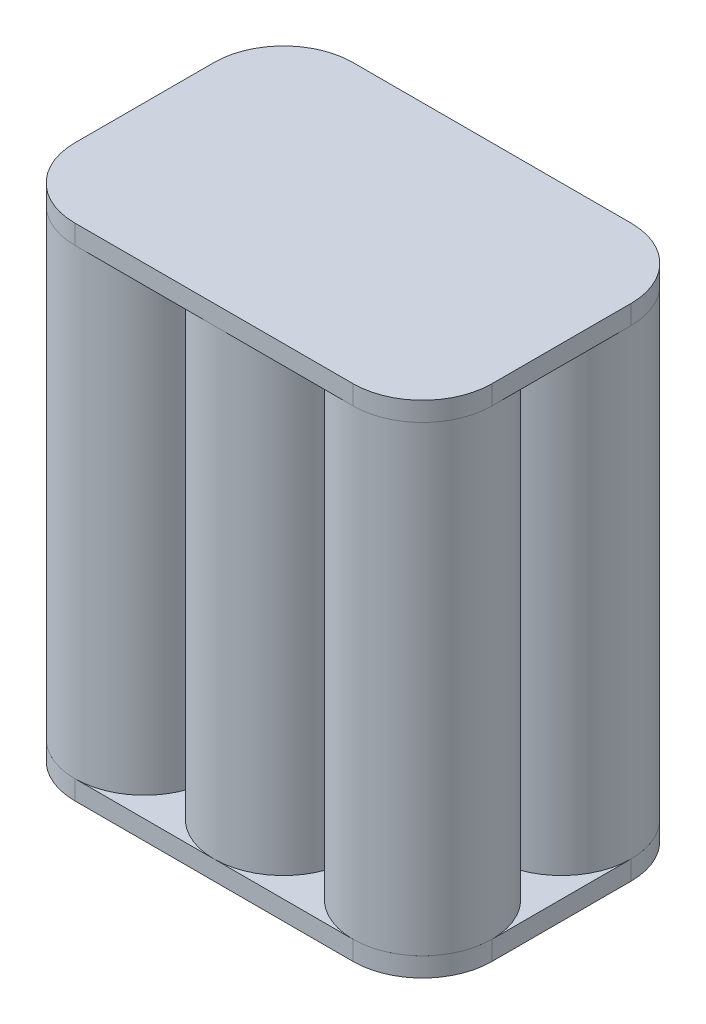
ISO-10303-21;
HEADER;
FILE_DESCRIPTION(('STEP AP214'),'2;1');
FILE_NAME('part.step','',(''),(''),'','','');
FILE_SCHEMA(('AUTOMOTIVE_DESIGN { 1 0 10303 214 1 1 1 1 }'));
ENDSEC;
DATA;
#1=APPLICATION_CONTEXT('core data for automotive mechanical design processes');
#2=APPLICATION_PROTOCOL_DEFINITION('international standard','automotive_design',2000,#1);
#3=PRODUCT_CONTEXT('',#1,'mechanical');
#4=PRODUCT('Part','Part','',(#3));
#5=PRODUCT_RELATED_PRODUCT_CATEGORY('part','',(#4));
#6=PRODUCT_DEFINITION_FORMATION('','',#4);
#7=PRODUCT_DEFINITION_CONTEXT('part definition',#1,'design');
#8=PRODUCT_DEFINITION('design','',#6,#7);
#9=PRODUCT_DEFINITION_SHAPE('','',#8);
#10=(LENGTH_UNIT() NAMED_UNIT(*) SI_UNIT(.MILLI.,.METRE.));
#11=(NAMED_UNIT(*) PLANE_ANGLE_UNIT() SI_UNIT($,.RADIAN.));
#12=(NAMED_UNIT(*) SI_UNIT($,.STERADIAN.) SOLID_ANGLE_UNIT());
#13=UNCERTAINTY_MEASURE_WITH_UNIT(LENGTH_MEASURE(1.E-05),#10,'distance_accuracy_value','');
#14=(GEOMETRIC_REPRESENTATION_CONTEXT(3) GLOBAL_UNCERTAINTY_ASSIGNED_CONTEXT((#13)) GLOBAL_UNIT_ASSIGNED_CONTEXT((#10,
#11,#12)) REPRESENTATION_CONTEXT('',''));
#15=CARTESIAN_POINT('',(0.,0.,0.));
#16=DIRECTION('',(0.,0.,1.));
#17=DIRECTION('',(1.,0.,0.));
#18=AXIS2_PLACEMENT_3D('',#15,#16,#17);
#19=CARTESIAN_POINT('',(0.,52.,0.));
#20=DIRECTION('',(0.,-1.,0.));
#21=DIRECTION('',(0.,0.,-1.));
#22=AXIS2_PLACEMENT_3D('',#19,#20,#21);
#23=CYLINDRICAL_SURFACE('',#22,7.22333333333333);
#24=CARTESIAN_POINT('',(0.,50.,0.));
#25=DIRECTION('',(0.,1.,0.));
#26=DIRECTION('',(0.,0.,1.));
#27=AXIS2_PLACEMENT_3D('',#24,#25,#26);
#28=CIRCLE('',#27,7.22333333333333);
#29=CARTESIAN_POINT('',(0.,50.,7.22333333333333));
#30=VERTEX_POINT('',#29);
#31=CARTESIAN_POINT('',(-7.22333333333338,50.,0.));
#32=VERTEX_POINT('',#31);
#33=EDGE_CURVE('E535',#30,#32,#28,.T.);
#34=ORIENTED_EDGE('',*,*,#33,.F.);
#35=DIRECTION('',(1.,0.,0.));
#36=VECTOR('',#35,1.);
#37=CARTESIAN_POINT('',(-7.22333333333338,50.,7.22333333333333));
#38=LINE('',#37,#36);
#39=CARTESIAN_POINT('',(-0.0033333331559219,50.,7.22333294877717));
#40=VERTEX_POINT('',#39);
#41=EDGE_CURVE('E492',#40,#30,#38,.T.);
#42=ORIENTED_EDGE('',*,*,#41,.F.);
#43=CARTESIAN_POINT('',(-7.2233329487772,50.,0.00333333315587462));
#44=VERTEX_POINT('',#43);
#45=EDGE_CURVE('E207',#44,#40,#28,.T.);
#46=ORIENTED_EDGE('',*,*,#45,.F.);
#47=EDGE_CURVE('E613',#32,#44,#28,.T.);
#48=ORIENTED_EDGE('',*,*,#47,.F.);
#49=EDGE_LOOP('',(#34,#42,#46,#48));
#50=FACE_BOUND('',#49,.T.);
#51=CARTESIAN_POINT('',(0.,2.,0.));
#52=DIRECTION('',(0.,-1.,0.));
#53=DIRECTION('',(0.,0.,-1.));
#54=AXIS2_PLACEMENT_3D('',#51,#52,#53);
#55=CIRCLE('',#54,7.22333333333333);
#56=CARTESIAN_POINT('',(0.,2.,7.22333333333333));
#57=VERTEX_POINT('',#56);
#58=CARTESIAN_POINT('',(-0.00333333315592277,2.,7.22333294877717));
#59=VERTEX_POINT('',#58);
#60=EDGE_CURVE('E498',#57,#59,#55,.T.);
#61=ORIENTED_EDGE('',*,*,#60,.F.);
#62=CARTESIAN_POINT('',(-7.22333333333338,2.,0.));
#63=VERTEX_POINT('',#62);
#64=EDGE_CURVE('E502',#63,#57,#55,.T.);
#65=ORIENTED_EDGE('',*,*,#64,.F.);
#66=DIRECTION('',(0.,0.,-1.));
#67=VECTOR('',#66,1.);
#68=CARTESIAN_POINT('',(-7.22333333333338,2.,7.22333333333333));
#69=LINE('',#68,#67);
#70=CARTESIAN_POINT('',(-7.2233329487772,2.,0.00333333315587245));
#71=VERTEX_POINT('',#70);
#72=EDGE_CURVE('E285',#71,#63,#69,.T.);
#73=ORIENTED_EDGE('',*,*,#72,.F.);
#74=EDGE_CURVE('E501',#59,#71,#55,.T.);
#75=ORIENTED_EDGE('',*,*,#74,.F.);
#76=EDGE_LOOP('',(#61,#65,#73,#75));
#77=FACE_BOUND('',#76,.T.);
#78=ADVANCED_FACE('F33',(#50,#77),#23,.T.);
#79=CARTESIAN_POINT('',(14.45,52.,0.));
#80=DIRECTION('',(0.,-1.,0.));
#81=DIRECTION('',(0.,0.,-1.));
#82=AXIS2_PLACEMENT_3D('',#79,#80,#81);
#83=CYLINDRICAL_SURFACE('',#82,7.22333333333333);
#84=CARTESIAN_POINT('',(14.45,50.,0.));
#85=DIRECTION('',(0.,1.,0.));
#86=DIRECTION('',(0.,0.,1.));
#87=AXIS2_PLACEMENT_3D('',#84,#85,#86);
#88=CIRCLE('',#87,7.22333333333333);
#89=CARTESIAN_POINT('',(14.45,50.,7.22333333333333));
#90=VERTEX_POINT('',#89);
#91=EDGE_CURVE('E416',#90,#90,#88,.F.);
#92=ORIENTED_EDGE('',*,*,#91,.T.);
#93=EDGE_LOOP('',(#92));
#94=FACE_BOUND('',#93,.T.);
#95=CARTESIAN_POINT('',(14.45,2.,0.));
#96=DIRECTION('',(0.,-1.,0.));
#97=DIRECTION('',(0.,0.,-1.));
#98=AXIS2_PLACEMENT_3D('',#95,#96,#97);
#99=CIRCLE('',#98,7.22333333333333);
#100=CARTESIAN_POINT('',(14.45,2.,7.22333333333333));
#101=VERTEX_POINT('',#100);
#102=EDGE_CURVE('E236',#101,#101,#99,.T.);
#103=ORIENTED_EDGE('',*,*,#102,.F.);
#104=EDGE_LOOP('',(#103));
#105=FACE_BOUND('',#104,.T.);
#106=ADVANCED_FACE('F321',(#94,#105),#83,.T.);
#107=CARTESIAN_POINT('',(28.9,52.,0.));
#108=DIRECTION('',(0.,-1.,0.));
#109=DIRECTION('',(0.,0.,-1.));
#110=AXIS2_PLACEMENT_3D('',#107,#108,#109);
#111=CYLINDRICAL_SURFACE('',#110,7.22333333333333);
#112=DIRECTION('',(0.,0.,-1.));
#113=VECTOR('',#112,1.);
#114=CARTESIAN_POINT('',(36.1233333333333,50.,-21.6733333333333));
#115=LINE('',#114,#113);
#116=CARTESIAN_POINT('',(36.1233329487771,50.,0.00333333315587117));
#117=VERTEX_POINT('',#116);
#118=CARTESIAN_POINT('',(36.1233333333333,50.,0.));
#119=VERTEX_POINT('',#118);
#120=EDGE_CURVE('E169',#117,#119,#115,.T.);
#121=ORIENTED_EDGE('',*,*,#120,.F.);
#122=CARTESIAN_POINT('',(28.9,50.,0.));
#123=DIRECTION('',(0.,1.,0.));
#124=DIRECTION('',(0.,0.,1.));
#125=AXIS2_PLACEMENT_3D('',#122,#123,#124);
#126=CIRCLE('',#125,7.22333333333333);
#127=CARTESIAN_POINT('',(28.9033333331558,50.,7.22333294877717));
#128=VERTEX_POINT('',#127);
#129=EDGE_CURVE('E411',#117,#128,#126,.F.);
#130=ORIENTED_EDGE('',*,*,#129,.T.);
#131=CARTESIAN_POINT('',(28.9,50.,7.22333333333333));
#132=VERTEX_POINT('',#131);
#133=EDGE_CURVE('E422',#132,#128,#38,.T.);
#134=ORIENTED_EDGE('',*,*,#133,.F.);
#135=EDGE_CURVE('E412',#132,#119,#126,.F.);
#136=ORIENTED_EDGE('',*,*,#135,.T.);
#137=EDGE_LOOP('',(#121,#130,#134,#136));
#138=FACE_BOUND('',#137,.T.);
#139=CARTESIAN_POINT('',(28.9,2.,0.));
#140=DIRECTION('',(0.,-1.,0.));
#141=DIRECTION('',(0.,0.,-1.));
#142=AXIS2_PLACEMENT_3D('',#139,#140,#141);
#143=CIRCLE('',#142,7.22333333333333);
#144=CARTESIAN_POINT('',(36.1233333333333,2.,0.));
#145=VERTEX_POINT('',#144);
#146=CARTESIAN_POINT('',(36.1233329487771,2.,0.00333333315587507));
#147=VERTEX_POINT('',#146);
#148=EDGE_CURVE('E245',#145,#147,#143,.T.);
#149=ORIENTED_EDGE('',*,*,#148,.F.);
#150=CARTESIAN_POINT('',(28.9,2.,7.22333333333333));
#151=VERTEX_POINT('',#150);
#152=EDGE_CURVE('E222',#151,#145,#143,.T.);
#153=ORIENTED_EDGE('',*,*,#152,.F.);
#154=DIRECTION('',(-1.,0.,0.));
#155=VECTOR('',#154,1.);
#156=CARTESIAN_POINT('',(-7.22333333333338,2.,7.22333333333333));
#157=LINE('',#156,#155);
#158=CARTESIAN_POINT('',(28.9033333331558,2.,7.22333294877717));
#159=VERTEX_POINT('',#158);
#160=EDGE_CURVE('E229',#159,#151,#157,.T.);
#161=ORIENTED_EDGE('',*,*,#160,.F.);
#162=EDGE_CURVE('E241',#147,#159,#143,.T.);
#163=ORIENTED_EDGE('',*,*,#162,.F.);
#164=EDGE_LOOP('',(#149,#153,#161,#163));
#165=FACE_BOUND('',#164,.T.);
#166=ADVANCED_FACE('F323',(#138,#165),#111,.T.);
#167=CARTESIAN_POINT('',(14.4499999999999,52.,-14.45));
#168=DIRECTION('',(0.,-1.,0.));
#169=DIRECTION('',(0.,0.,-1.));
#170=AXIS2_PLACEMENT_3D('',#167,#168,#169);
#171=CYLINDRICAL_SURFACE('',#170,7.22333333333334);
#172=CARTESIAN_POINT('',(14.4499999999999,50.,-14.45));
#173=DIRECTION('',(0.,1.,0.));
#174=DIRECTION('',(0.,0.,1.));
#175=AXIS2_PLACEMENT_3D('',#172,#173,#174);
#176=CIRCLE('',#175,7.22333333333334);
#177=CARTESIAN_POINT('',(14.4499999999999,50.,-21.6733333333333));
#178=VERTEX_POINT('',#177);
#179=EDGE_CURVE('E402',#178,#178,#176,.F.);
#180=ORIENTED_EDGE('',*,*,#179,.T.);
#181=EDGE_LOOP('',(#180));
#182=FACE_BOUND('',#181,.T.);
#183=CARTESIAN_POINT('',(14.4499999999999,2.,-14.45));
#184=DIRECTION('',(0.,-1.,0.));
#185=DIRECTION('',(0.,0.,-1.));
#186=AXIS2_PLACEMENT_3D('',#183,#184,#185);
#187=CIRCLE('',#186,7.22333333333334);
#188=CARTESIAN_POINT('',(14.4499999999999,2.,-21.6733333333333));
#189=VERTEX_POINT('',#188);
#190=EDGE_CURVE('E232',#189,#189,#187,.T.);
#191=ORIENTED_EDGE('',*,*,#190,.F.);
#192=EDGE_LOOP('',(#191));
#193=FACE_BOUND('',#192,.T.);
#194=ADVANCED_FACE('F330',(#182,#193),#171,.T.);
#195=CARTESIAN_POINT('',(28.8999999999999,52.,-14.45));
#196=DIRECTION('',(0.,-1.,0.));
#197=DIRECTION('',(0.,0.,-1.));
#198=AXIS2_PLACEMENT_3D('',#195,#196,#197);
#199=CYLINDRICAL_SURFACE('',#198,7.22333333333334);
#200=CARTESIAN_POINT('',(28.8999999999999,50.,-14.45));
#201=DIRECTION('',(0.,1.,0.));
#202=DIRECTION('',(0.,0.,1.));
#203=AXIS2_PLACEMENT_3D('',#200,#201,#202);
#204=CIRCLE('',#203,7.22333333333334);
#205=CARTESIAN_POINT('',(36.1233333333333,50.,-14.45));
#206=VERTEX_POINT('',#205);
#207=CARTESIAN_POINT('',(28.8999999999999,50.,-21.6733333333333));
#208=VERTEX_POINT('',#207);
#209=EDGE_CURVE('E176',#206,#208,#204,.F.);
#210=ORIENTED_EDGE('',*,*,#209,.T.);
#211=DIRECTION('',(-1.,0.,0.));
#212=VECTOR('',#211,1.);
#213=CARTESIAN_POINT('',(-7.22333333333338,50.,-21.6733333333333));
#214=LINE('',#213,#212);
#215=CARTESIAN_POINT('',(28.9033333331558,50.,-21.6733329487772));
#216=VERTEX_POINT('',#215);
#217=EDGE_CURVE('E197',#216,#208,#214,.T.);
#218=ORIENTED_EDGE('',*,*,#217,.F.);
#219=CARTESIAN_POINT('',(36.1233329487771,50.,-14.4533333331559));
#220=VERTEX_POINT('',#219);
#221=EDGE_CURVE('E58',#216,#220,#204,.F.);
#222=ORIENTED_EDGE('',*,*,#221,.T.);
#223=EDGE_CURVE('E403',#206,#220,#115,.T.);
#224=ORIENTED_EDGE('',*,*,#223,.F.);
#225=EDGE_LOOP('',(#210,#218,#222,#224));
#226=FACE_BOUND('',#225,.T.);
#227=CARTESIAN_POINT('',(28.8999999999999,2.,-14.45));
#228=DIRECTION('',(0.,-1.,0.));
#229=DIRECTION('',(0.,0.,-1.));
#230=AXIS2_PLACEMENT_3D('',#227,#228,#229);
#231=CIRCLE('',#230,7.22333333333334);
#232=CARTESIAN_POINT('',(28.8999999999999,2.,-21.6733333333333));
#233=VERTEX_POINT('',#232);
#234=CARTESIAN_POINT('',(28.9033333331558,2.,-21.6733329487772));
#235=VERTEX_POINT('',#234);
#236=EDGE_CURVE('E219',#233,#235,#231,.T.);
#237=ORIENTED_EDGE('',*,*,#236,.F.);
#238=CARTESIAN_POINT('',(36.1233333333333,2.,-14.45));
#239=VERTEX_POINT('',#238);
#240=EDGE_CURVE('E224',#239,#233,#231,.T.);
#241=ORIENTED_EDGE('',*,*,#240,.F.);
#242=DIRECTION('',(0.,0.,1.));
#243=VECTOR('',#242,1.);
#244=CARTESIAN_POINT('',(36.1233333333333,2.,7.22333333333333));
#245=LINE('',#244,#243);
#246=CARTESIAN_POINT('',(36.1233329487771,2.,-14.4533333331559));
#247=VERTEX_POINT('',#246);
#248=EDGE_CURVE('E50',#247,#239,#245,.T.);
#249=ORIENTED_EDGE('',*,*,#248,.F.);
#250=EDGE_CURVE('E223',#235,#247,#231,.T.);
#251=ORIENTED_EDGE('',*,*,#250,.F.);
#252=EDGE_LOOP('',(#237,#241,#249,#251));
#253=FACE_BOUND('',#252,.T.);
#254=ADVANCED_FACE('F546',(#226,#253),#199,.T.);
#255=CARTESIAN_POINT('',(0.,52.,-14.45));
#256=DIRECTION('',(0.,-1.,0.));
#257=DIRECTION('',(0.,0.,-1.));
#258=AXIS2_PLACEMENT_3D('',#255,#256,#257);
#259=CYLINDRICAL_SURFACE('',#258,7.22333333333333);
#260=CARTESIAN_POINT('',(0.,50.,-14.45));
#261=DIRECTION('',(0.,1.,0.));
#262=DIRECTION('',(0.,0.,1.));
#263=AXIS2_PLACEMENT_3D('',#260,#261,#262);
#264=CIRCLE('',#263,7.22333333333333);
#265=CARTESIAN_POINT('',(0.,50.,-21.6733333333333));
#266=VERTEX_POINT('',#265);
#267=CARTESIAN_POINT('',(-7.22333333333338,50.,-14.45));
#268=VERTEX_POINT('',#267);
#269=EDGE_CURVE('E177',#266,#268,#264,.F.);
#270=ORIENTED_EDGE('',*,*,#269,.T.);
#271=DIRECTION('',(0.,0.,1.));
#272=VECTOR('',#271,1.);
#273=CARTESIAN_POINT('',(-7.22333333333338,50.,-21.6733333333333));
#274=LINE('',#273,#272);
#275=CARTESIAN_POINT('',(-7.22333294877722,50.,-14.4533333331559));
#276=VERTEX_POINT('',#275);
#277=EDGE_CURVE('E174',#276,#268,#274,.T.);
#278=ORIENTED_EDGE('',*,*,#277,.F.);
#279=CARTESIAN_POINT('',(-0.00333333315592364,50.,-21.6733329487772));
#280=VERTEX_POINT('',#279);
#281=EDGE_CURVE('E147',#276,#280,#264,.F.);
#282=ORIENTED_EDGE('',*,*,#281,.T.);
#283=EDGE_CURVE('E158',#266,#280,#214,.T.);
#284=ORIENTED_EDGE('',*,*,#283,.F.);
#285=EDGE_LOOP('',(#270,#278,#282,#284));
#286=FACE_BOUND('',#285,.T.);
#287=CARTESIAN_POINT('',(0.,2.,-14.45));
#288=DIRECTION('',(0.,-1.,0.));
#289=DIRECTION('',(0.,0.,-1.));
#290=AXIS2_PLACEMENT_3D('',#287,#288,#289);
#291=CIRCLE('',#290,7.22333333333333);
#292=CARTESIAN_POINT('',(0.,2.,-21.6733333333333));
#293=VERTEX_POINT('',#292);
#294=CARTESIAN_POINT('',(-7.22333333333338,2.,-14.45));
#295=VERTEX_POINT('',#294);
#296=EDGE_CURVE('E237',#293,#295,#291,.T.);
#297=ORIENTED_EDGE('',*,*,#296,.F.);
#298=DIRECTION('',(1.,0.,0.));
#299=VECTOR('',#298,1.);
#300=CARTESIAN_POINT('',(-7.22333333333338,2.,-21.6733333333333));
#301=LINE('',#300,#299);
#302=CARTESIAN_POINT('',(-0.00333333315592103,2.,-21.6733329487772));
#303=VERTEX_POINT('',#302);
#304=EDGE_CURVE('E451',#303,#293,#301,.T.);
#305=ORIENTED_EDGE('',*,*,#304,.F.);
#306=CARTESIAN_POINT('',(-7.22333294877722,2.,-14.4533333331559));
#307=VERTEX_POINT('',#306);
#308=EDGE_CURVE('E531',#307,#303,#291,.T.);
#309=ORIENTED_EDGE('',*,*,#308,.F.);
#310=EDGE_CURVE('E528',#295,#307,#291,.T.);
#311=ORIENTED_EDGE('',*,*,#310,.F.);
#312=EDGE_LOOP('',(#297,#305,#309,#311));
#313=FACE_BOUND('',#312,.T.);
#314=ADVANCED_FACE('F171',(#286,#313),#259,.T.);
#315=CARTESIAN_POINT('',(0.,50.,0.));
#316=DIRECTION('',(0.,1.,0.));
#317=DIRECTION('',(0.,0.,1.));
#318=AXIS2_PLACEMENT_3D('',#315,#316,#317);
#319=PLANE('',#318);
#320=ORIENTED_EDGE('',*,*,#281,.F.);
#321=CARTESIAN_POINT('',(-0.00333333333338379,50.,-14.4533333333333));
#322=DIRECTION('',(0.,1.,0.));
#323=DIRECTION('',(0.,0.,1.));
#324=AXIS2_PLACEMENT_3D('',#321,#322,#323);
#325=CIRCLE('',#324,7.22);
#326=EDGE_CURVE('E143',#276,#280,#325,.F.);
#327=ORIENTED_EDGE('',*,*,#326,.T.);
#328=EDGE_LOOP('',(#320,#327));
#329=FACE_BOUND('',#328,.T.);
#330=ADVANCED_FACE('F145',(#329),#319,.F.);
#331=ORIENTED_EDGE('',*,*,#221,.F.);
#332=CARTESIAN_POINT('',(28.9033333333333,50.,-14.4533333333333));
#333=DIRECTION('',(0.,1.,0.));
#334=DIRECTION('',(0.,0.,1.));
#335=AXIS2_PLACEMENT_3D('',#332,#333,#334);
#336=CIRCLE('',#335,7.22);
#337=EDGE_CURVE('E42',#216,#220,#336,.F.);
#338=ORIENTED_EDGE('',*,*,#337,.T.);
#339=EDGE_LOOP('',(#331,#338));
#340=FACE_BOUND('',#339,.T.);
#341=ADVANCED_FACE('F692',(#340),#319,.F.);
#342=ORIENTED_EDGE('',*,*,#269,.F.);
#343=EDGE_CURVE('E165',#178,#266,#214,.T.);
#344=ORIENTED_EDGE('',*,*,#343,.F.);
#345=ORIENTED_EDGE('',*,*,#179,.F.);
#346=EDGE_CURVE('E193',#208,#178,#214,.T.);
#347=ORIENTED_EDGE('',*,*,#346,.F.);
#348=ORIENTED_EDGE('',*,*,#209,.F.);
#349=EDGE_CURVE('E198',#119,#206,#115,.T.);
#350=ORIENTED_EDGE('',*,*,#349,.F.);
#351=ORIENTED_EDGE('',*,*,#135,.F.);
#352=EDGE_CURVE('E665',#90,#132,#38,.T.);
#353=ORIENTED_EDGE('',*,*,#352,.F.);
#354=ORIENTED_EDGE('',*,*,#91,.F.);
#355=EDGE_CURVE('E666',#30,#90,#38,.T.);
#356=ORIENTED_EDGE('',*,*,#355,.F.);
#357=ORIENTED_EDGE('',*,*,#33,.T.);
#358=EDGE_CURVE('E668',#268,#32,#274,.T.);
#359=ORIENTED_EDGE('',*,*,#358,.F.);
#360=EDGE_LOOP('',(#342,#344,#345,#347,#348,#350,#351,#353,#354,#356,#357,#359));
#361=FACE_BOUND('',#360,.T.);
#362=ADVANCED_FACE('F656',(#361),#319,.F.);
#363=ORIENTED_EDGE('',*,*,#129,.F.);
#364=CARTESIAN_POINT('',(28.9033333333333,50.,0.00333333333333349));
#365=DIRECTION('',(0.,1.,0.));
#366=DIRECTION('',(0.,0.,1.));
#367=AXIS2_PLACEMENT_3D('',#364,#365,#366);
#368=CIRCLE('',#367,7.22);
#369=EDGE_CURVE('E424',#117,#128,#368,.F.);
#370=ORIENTED_EDGE('',*,*,#369,.T.);
#371=EDGE_LOOP('',(#363,#370));
#372=FACE_BOUND('',#371,.T.);
#373=ADVANCED_FACE('F344',(#372),#319,.F.);
#374=CARTESIAN_POINT('',(-7.22333333333338,50.,-21.6733333333333));
#375=DIRECTION('',(-1.,0.,0.));
#376=DIRECTION('',(0.,0.,1.));
#377=AXIS2_PLACEMENT_3D('',#374,#375,#376);
#378=PLANE('',#377);
#379=ORIENTED_EDGE('',*,*,#47,.T.);
#380=DIRECTION('',(0.,1.,0.));
#381=VECTOR('',#380,1.);
#382=CARTESIAN_POINT('',(-7.22333333333338,50.,0.00333333333333435));
#383=LINE('',#382,#381);
#384=CARTESIAN_POINT('',(-7.22333333333338,52.,0.00333333333333435));
#385=VERTEX_POINT('',#384);
#386=EDGE_CURVE('E604',#44,#385,#383,.T.);
#387=ORIENTED_EDGE('',*,*,#386,.T.);
#388=DIRECTION('',(0.,0.,1.));
#389=VECTOR('',#388,1.);
#390=CARTESIAN_POINT('',(-7.22333333333338,52.,-21.6733333333333));
#391=LINE('',#390,#389);
#392=CARTESIAN_POINT('',(-7.22333333333338,52.,-14.4533333333333));
#393=VERTEX_POINT('',#392);
#394=EDGE_CURVE('E201',#393,#385,#391,.T.);
#395=ORIENTED_EDGE('',*,*,#394,.F.);
#396=DIRECTION('',(0.,1.,0.));
#397=VECTOR('',#396,1.);
#398=CARTESIAN_POINT('',(-7.22333333333338,50.,-14.4533333333333));
#399=LINE('',#398,#397);
#400=EDGE_CURVE('E252',#393,#276,#399,.F.);
#401=ORIENTED_EDGE('',*,*,#400,.T.);
#402=ORIENTED_EDGE('',*,*,#277,.T.);
#403=ORIENTED_EDGE('',*,*,#358,.T.);
#404=EDGE_LOOP('',(#379,#387,#395,#401,#402,#403));
#405=FACE_BOUND('',#404,.T.);
#406=ADVANCED_FACE('F353',(#405),#378,.T.);
#407=CARTESIAN_POINT('',(-7.22333333333338,50.,7.22333333333333));
#408=DIRECTION('',(0.,0.,1.));
#409=DIRECTION('',(1.,0.,0.));
#410=AXIS2_PLACEMENT_3D('',#407,#408,#409);
#411=PLANE('',#410);
#412=ORIENTED_EDGE('',*,*,#133,.T.);
#413=DIRECTION('',(0.,1.,0.));
#414=VECTOR('',#413,1.);
#415=CARTESIAN_POINT('',(28.9033333333333,50.,7.22333333333333));
#416=LINE('',#415,#414);
#417=CARTESIAN_POINT('',(28.9033333333333,52.,7.22333333333333));
#418=VERTEX_POINT('',#417);
#419=EDGE_CURVE('E472',#128,#418,#416,.T.);
#420=ORIENTED_EDGE('',*,*,#419,.T.);
#421=DIRECTION('',(1.,0.,0.));
#422=VECTOR('',#421,1.);
#423=CARTESIAN_POINT('',(-7.22333333333338,52.,7.22333333333333));
#424=LINE('',#423,#422);
#425=CARTESIAN_POINT('',(-0.00333333333338206,52.,7.22333333333333));
#426=VERTEX_POINT('',#425);
#427=EDGE_CURVE('E682',#426,#418,#424,.T.);
#428=ORIENTED_EDGE('',*,*,#427,.F.);
#429=DIRECTION('',(0.,1.,0.));
#430=VECTOR('',#429,1.);
#431=CARTESIAN_POINT('',(-0.00333333333338206,50.,7.22333333333333));
#432=LINE('',#431,#430);
#433=EDGE_CURVE('E479',#426,#40,#432,.F.);
#434=ORIENTED_EDGE('',*,*,#433,.T.);
#435=ORIENTED_EDGE('',*,*,#41,.T.);
#436=ORIENTED_EDGE('',*,*,#355,.T.);
#437=ORIENTED_EDGE('',*,*,#352,.T.);
#438=EDGE_LOOP('',(#412,#420,#428,#434,#435,#436,#437));
#439=FACE_BOUND('',#438,.T.);
#440=ADVANCED_FACE('F347',(#439),#411,.T.);
#441=CARTESIAN_POINT('',(-7.22333333333338,50.,-21.6733333333333));
#442=DIRECTION('',(0.,0.,-1.));
#443=DIRECTION('',(-1.,0.,0.));
#444=AXIS2_PLACEMENT_3D('',#441,#442,#443);
#445=PLANE('',#444);
#446=ORIENTED_EDGE('',*,*,#283,.T.);
#447=DIRECTION('',(0.,1.,0.));
#448=VECTOR('',#447,1.);
#449=CARTESIAN_POINT('',(-0.00333333333338379,50.,-21.6733333333333));
#450=LINE('',#449,#448);
#451=CARTESIAN_POINT('',(-0.00333333333338379,52.,-21.6733333333333));
#452=VERTEX_POINT('',#451);
#453=EDGE_CURVE('E152',#280,#452,#450,.T.);
#454=ORIENTED_EDGE('',*,*,#453,.T.);
#455=DIRECTION('',(-1.,0.,0.));
#456=VECTOR('',#455,1.);
#457=CARTESIAN_POINT('',(-7.22333333333338,52.,-21.6733333333333));
#458=LINE('',#457,#456);
#459=CARTESIAN_POINT('',(28.9033333333333,52.,-21.6733333333333));
#460=VERTEX_POINT('',#459);
#461=EDGE_CURVE('E671',#460,#452,#458,.T.);
#462=ORIENTED_EDGE('',*,*,#461,.F.);
#463=DIRECTION('',(0.,1.,0.));
#464=VECTOR('',#463,1.);
#465=CARTESIAN_POINT('',(28.9033333333333,50.,-21.6733333333333));
#466=LINE('',#465,#464);
#467=EDGE_CURVE('E181',#460,#216,#466,.F.);
#468=ORIENTED_EDGE('',*,*,#467,.T.);
#469=ORIENTED_EDGE('',*,*,#217,.T.);
#470=ORIENTED_EDGE('',*,*,#346,.T.);
#471=ORIENTED_EDGE('',*,*,#343,.T.);
#472=EDGE_LOOP('',(#446,#454,#462,#468,#469,#470,#471));
#473=FACE_BOUND('',#472,.T.);
#474=ADVANCED_FACE('F159',(#473),#445,.T.);
#475=CARTESIAN_POINT('',(36.1233333333333,50.,-21.6733333333333));
#476=DIRECTION('',(1.,0.,0.));
#477=DIRECTION('',(0.,0.,-1.));
#478=AXIS2_PLACEMENT_3D('',#475,#476,#477);
#479=PLANE('',#478);
#480=DIRECTION('',(0.,0.,-1.));
#481=VECTOR('',#480,1.);
#482=CARTESIAN_POINT('',(36.1233333333333,52.,-21.6733333333333));
#483=LINE('',#482,#481);
#484=CARTESIAN_POINT('',(36.1233333333333,52.,0.00333333333333088));
#485=VERTEX_POINT('',#484);
#486=CARTESIAN_POINT('',(36.1233333333333,52.,-14.4533333333333));
#487=VERTEX_POINT('',#486);
#488=EDGE_CURVE('E681',#485,#487,#483,.T.);
#489=ORIENTED_EDGE('',*,*,#488,.F.);
#490=DIRECTION('',(0.,1.,0.));
#491=VECTOR('',#490,1.);
#492=CARTESIAN_POINT('',(36.1233333333333,50.,0.00333333333333088));
#493=LINE('',#492,#491);
#494=EDGE_CURVE('E427',#485,#117,#493,.F.);
#495=ORIENTED_EDGE('',*,*,#494,.T.);
#496=ORIENTED_EDGE('',*,*,#120,.T.);
#497=ORIENTED_EDGE('',*,*,#349,.T.);
#498=ORIENTED_EDGE('',*,*,#223,.T.);
#499=DIRECTION('',(0.,1.,0.));
#500=VECTOR('',#499,1.);
#501=CARTESIAN_POINT('',(36.1233333333333,50.,-14.4533333333333));
#502=LINE('',#501,#500);
#503=EDGE_CURVE('E397',#220,#487,#502,.T.);
#504=ORIENTED_EDGE('',*,*,#503,.T.);
#505=EDGE_LOOP('',(#489,#495,#496,#497,#498,#504));
#506=FACE_BOUND('',#505,.T.);
#507=ADVANCED_FACE('F342',(#506),#479,.T.);
#508=ORIENTED_EDGE('',*,*,#45,.T.);
#509=CARTESIAN_POINT('',(-0.00333333333338206,50.,0.00333333333333435));
#510=DIRECTION('',(0.,1.,0.));
#511=DIRECTION('',(0.,0.,1.));
#512=AXIS2_PLACEMENT_3D('',#509,#510,#511);
#513=CIRCLE('',#512,7.22);
#514=EDGE_CURVE('E603',#40,#44,#513,.F.);
#515=ORIENTED_EDGE('',*,*,#514,.T.);
#516=EDGE_LOOP('',(#508,#515));
#517=FACE_BOUND('',#516,.T.);
#518=ADVANCED_FACE('F338',(#517),#319,.F.);
#519=CARTESIAN_POINT('',(0.,52.,0.));
#520=DIRECTION('',(0.,1.,0.));
#521=DIRECTION('',(0.,0.,1.));
#522=AXIS2_PLACEMENT_3D('',#519,#520,#521);
#523=PLANE('',#522);
#524=ORIENTED_EDGE('',*,*,#427,.T.);
#525=CARTESIAN_POINT('',(28.9033333333333,52.,0.00333333333333349));
#526=DIRECTION('',(0.,1.,0.));
#527=DIRECTION('',(0.,0.,1.));
#528=AXIS2_PLACEMENT_3D('',#525,#526,#527);
#529=CIRCLE('',#528,7.22);
#530=EDGE_CURVE('E476',#418,#485,#529,.T.);
#531=ORIENTED_EDGE('',*,*,#530,.T.);
#532=ORIENTED_EDGE('',*,*,#488,.T.);
#533=CARTESIAN_POINT('',(28.9033333333333,52.,-14.4533333333333));
#534=DIRECTION('',(0.,1.,0.));
#535=DIRECTION('',(0.,0.,1.));
#536=AXIS2_PLACEMENT_3D('',#533,#534,#535);
#537=CIRCLE('',#536,7.22);
#538=EDGE_CURVE('E470',#487,#460,#537,.T.);
#539=ORIENTED_EDGE('',*,*,#538,.T.);
#540=ORIENTED_EDGE('',*,*,#461,.T.);
#541=CARTESIAN_POINT('',(-0.00333333333338379,52.,-14.4533333333333));
#542=DIRECTION('',(0.,1.,0.));
#543=DIRECTION('',(0.,0.,1.));
#544=AXIS2_PLACEMENT_3D('',#541,#542,#543);
#545=CIRCLE('',#544,7.22);
#546=EDGE_CURVE('E180',#452,#393,#545,.T.);
#547=ORIENTED_EDGE('',*,*,#546,.T.);
#548=ORIENTED_EDGE('',*,*,#394,.T.);
#549=CARTESIAN_POINT('',(-0.00333333333338206,52.,0.00333333333333435));
#550=DIRECTION('',(0.,1.,0.));
#551=DIRECTION('',(0.,0.,1.));
#552=AXIS2_PLACEMENT_3D('',#549,#550,#551);
#553=CIRCLE('',#552,7.22);
#554=EDGE_CURVE('E474',#385,#426,#553,.T.);
#555=ORIENTED_EDGE('',*,*,#554,.T.);
#556=EDGE_LOOP('',(#524,#531,#532,#539,#540,#547,#548,#555));
#557=FACE_BOUND('',#556,.T.);
#558=ADVANCED_FACE('F341',(#557),#523,.T.);
#559=CARTESIAN_POINT('',(-7.22333333333338,2.,7.22333333333333));
#560=DIRECTION('',(0.,0.,1.));
#561=DIRECTION('',(1.,0.,0.));
#562=AXIS2_PLACEMENT_3D('',#559,#560,#561);
#563=PLANE('',#562);
#564=DIRECTION('',(-1.,0.,0.));
#565=VECTOR('',#564,1.);
#566=CARTESIAN_POINT('',(-7.22333333333338,0.,7.22333333333333));
#567=LINE('',#566,#565);
#568=CARTESIAN_POINT('',(28.9033333333333,0.,7.22333333333333));
#569=VERTEX_POINT('',#568);
#570=CARTESIAN_POINT('',(-0.00333333333338293,0.,7.22333333333333));
#571=VERTEX_POINT('',#570);
#572=EDGE_CURVE('E230',#569,#571,#567,.T.);
#573=ORIENTED_EDGE('',*,*,#572,.F.);
#574=DIRECTION('',(0.,-1.,0.));
#575=VECTOR('',#574,1.);
#576=CARTESIAN_POINT('',(28.9033333333333,2.,7.22333333333333));
#577=LINE('',#576,#575);
#578=EDGE_CURVE('E253',#569,#159,#577,.F.);
#579=ORIENTED_EDGE('',*,*,#578,.T.);
#580=ORIENTED_EDGE('',*,*,#160,.T.);
#581=EDGE_CURVE('E259',#151,#101,#157,.T.);
#582=ORIENTED_EDGE('',*,*,#581,.T.);
#583=EDGE_CURVE('E261',#101,#57,#157,.T.);
#584=ORIENTED_EDGE('',*,*,#583,.T.);
#585=ORIENTED_EDGE('',*,*,#60,.T.);
#586=DIRECTION('',(0.,-1.,0.));
#587=VECTOR('',#586,1.);
#588=CARTESIAN_POINT('',(-0.00333333333338293,2.,7.22333333333333));
#589=LINE('',#588,#587);
#590=EDGE_CURVE('E438',#59,#571,#589,.T.);
#591=ORIENTED_EDGE('',*,*,#590,.T.);
#592=EDGE_LOOP('',(#573,#579,#580,#582,#584,#585,#591));
#593=FACE_BOUND('',#592,.T.);
#594=ADVANCED_FACE('F360',(#593),#563,.T.);
#595=CARTESIAN_POINT('',(36.1233333333333,2.,7.22333333333333));
#596=DIRECTION('',(1.,0.,0.));
#597=DIRECTION('',(0.,0.,-1.));
#598=AXIS2_PLACEMENT_3D('',#595,#596,#597);
#599=PLANE('',#598);
#600=ORIENTED_EDGE('',*,*,#148,.T.);
#601=DIRECTION('',(0.,-1.,0.));
#602=VECTOR('',#601,1.);
#603=CARTESIAN_POINT('',(36.1233333333333,2.,0.00333333333333522));
#604=LINE('',#603,#602);
#605=CARTESIAN_POINT('',(36.1233333333333,0.,0.00333333333333522));
#606=VERTEX_POINT('',#605);
#607=EDGE_CURVE('E436',#147,#606,#604,.T.);
#608=ORIENTED_EDGE('',*,*,#607,.T.);
#609=DIRECTION('',(0.,0.,1.));
#610=VECTOR('',#609,1.);
#611=CARTESIAN_POINT('',(36.1233333333333,0.,7.22333333333333));
#612=LINE('',#611,#610);
#613=CARTESIAN_POINT('',(36.1233333333333,0.,-14.4533333333333));
#614=VERTEX_POINT('',#613);
#615=EDGE_CURVE('E274',#614,#606,#612,.T.);
#616=ORIENTED_EDGE('',*,*,#615,.F.);
#617=DIRECTION('',(0.,-1.,0.));
#618=VECTOR('',#617,1.);
#619=CARTESIAN_POINT('',(36.1233333333333,2.,-14.4533333333333));
#620=LINE('',#619,#618);
#621=EDGE_CURVE('E426',#614,#247,#620,.F.);
#622=ORIENTED_EDGE('',*,*,#621,.T.);
#623=ORIENTED_EDGE('',*,*,#248,.T.);
#624=EDGE_CURVE('E266',#239,#145,#245,.T.);
#625=ORIENTED_EDGE('',*,*,#624,.T.);
#626=EDGE_LOOP('',(#600,#608,#616,#622,#623,#625));
#627=FACE_BOUND('',#626,.T.);
#628=ADVANCED_FACE('F509',(#627),#599,.T.);
#629=CARTESIAN_POINT('',(0.,2.,0.));
#630=DIRECTION('',(0.,-1.,0.));
#631=DIRECTION('',(0.,0.,-1.));
#632=AXIS2_PLACEMENT_3D('',#629,#630,#631);
#633=PLANE('',#632);
#634=ORIENTED_EDGE('',*,*,#74,.T.);
#635=CARTESIAN_POINT('',(-0.00333333333338293,2.,0.00333333333333349));
#636=DIRECTION('',(0.,-1.,0.));
#637=DIRECTION('',(0.,0.,-1.));
#638=AXIS2_PLACEMENT_3D('',#635,#636,#637);
#639=CIRCLE('',#638,7.22);
#640=EDGE_CURVE('E184',#71,#59,#639,.F.);
#641=ORIENTED_EDGE('',*,*,#640,.T.);
#642=EDGE_LOOP('',(#634,#641));
#643=FACE_BOUND('',#642,.T.);
#644=ADVANCED_FACE('F556',(#643),#633,.F.);
#645=ORIENTED_EDGE('',*,*,#162,.T.);
#646=CARTESIAN_POINT('',(28.9033333333333,2.,0.00333333333333349));
#647=DIRECTION('',(0.,-1.,0.));
#648=DIRECTION('',(0.,0.,-1.));
#649=AXIS2_PLACEMENT_3D('',#646,#647,#648);
#650=CIRCLE('',#649,7.22);
#651=EDGE_CURVE('E250',#159,#147,#650,.F.);
#652=ORIENTED_EDGE('',*,*,#651,.T.);
#653=EDGE_LOOP('',(#645,#652));
#654=FACE_BOUND('',#653,.T.);
#655=ADVANCED_FACE('F549',(#654),#633,.F.);
#656=ORIENTED_EDGE('',*,*,#250,.T.);
#657=CARTESIAN_POINT('',(28.9033333333333,2.,-14.4533333333333));
#658=DIRECTION('',(0.,-1.,0.));
#659=DIRECTION('',(0.,0.,-1.));
#660=AXIS2_PLACEMENT_3D('',#657,#658,#659);
#661=CIRCLE('',#660,7.22);
#662=EDGE_CURVE('E11',#247,#235,#661,.F.);
#663=ORIENTED_EDGE('',*,*,#662,.T.);
#664=EDGE_LOOP('',(#656,#663));
#665=FACE_BOUND('',#664,.T.);
#666=ADVANCED_FACE('F547',(#665),#633,.F.);
#667=EDGE_CURVE('E281',#63,#295,#69,.T.);
#668=ORIENTED_EDGE('',*,*,#667,.F.);
#669=ORIENTED_EDGE('',*,*,#64,.T.);
#670=ORIENTED_EDGE('',*,*,#583,.F.);
#671=ORIENTED_EDGE('',*,*,#102,.T.);
#672=ORIENTED_EDGE('',*,*,#581,.F.);
#673=ORIENTED_EDGE('',*,*,#152,.T.);
#674=ORIENTED_EDGE('',*,*,#624,.F.);
#675=ORIENTED_EDGE('',*,*,#240,.T.);
#676=EDGE_CURVE('E292',#189,#233,#301,.T.);
#677=ORIENTED_EDGE('',*,*,#676,.F.);
#678=ORIENTED_EDGE('',*,*,#190,.T.);
#679=EDGE_CURVE('E455',#293,#189,#301,.T.);
#680=ORIENTED_EDGE('',*,*,#679,.F.);
#681=ORIENTED_EDGE('',*,*,#296,.T.);
#682=EDGE_LOOP('',(#668,#669,#670,#671,#672,#673,#674,#675,#677,#678,#680,#681));
#683=FACE_BOUND('',#682,.T.);
#684=ADVANCED_FACE('F313',(#683),#633,.F.);
#685=CARTESIAN_POINT('',(-7.22333333333338,2.,7.22333333333333));
#686=DIRECTION('',(-1.,0.,0.));
#687=DIRECTION('',(0.,0.,1.));
#688=AXIS2_PLACEMENT_3D('',#685,#686,#687);
#689=PLANE('',#688);
#690=ORIENTED_EDGE('',*,*,#310,.T.);
#691=DIRECTION('',(0.,-1.,0.));
#692=VECTOR('',#691,1.);
#693=CARTESIAN_POINT('',(-7.22333333333338,2.,-14.4533333333333));
#694=LINE('',#693,#692);
#695=CARTESIAN_POINT('',(-7.22333333333338,0.,-14.4533333333333));
#696=VERTEX_POINT('',#695);
#697=EDGE_CURVE('E301',#307,#696,#694,.T.);
#698=ORIENTED_EDGE('',*,*,#697,.T.);
#699=DIRECTION('',(0.,0.,-1.));
#700=VECTOR('',#699,1.);
#701=CARTESIAN_POINT('',(-7.22333333333338,0.,7.22333333333333));
#702=LINE('',#701,#700);
#703=CARTESIAN_POINT('',(-7.22333333333338,0.,0.00333333333333262));
#704=VERTEX_POINT('',#703);
#705=EDGE_CURVE('E269',#704,#696,#702,.T.);
#706=ORIENTED_EDGE('',*,*,#705,.F.);
#707=DIRECTION('',(0.,-1.,0.));
#708=VECTOR('',#707,1.);
#709=CARTESIAN_POINT('',(-7.22333333333338,2.,0.00333333333333262));
#710=LINE('',#709,#708);
#711=EDGE_CURVE('E299',#704,#71,#710,.F.);
#712=ORIENTED_EDGE('',*,*,#711,.T.);
#713=ORIENTED_EDGE('',*,*,#72,.T.);
#714=ORIENTED_EDGE('',*,*,#667,.T.);
#715=EDGE_LOOP('',(#690,#698,#706,#712,#713,#714));
#716=FACE_BOUND('',#715,.T.);
#717=ADVANCED_FACE('F555',(#716),#689,.T.);
#718=CARTESIAN_POINT('',(-7.22333333333338,2.,-21.6733333333333));
#719=DIRECTION('',(0.,0.,-1.));
#720=DIRECTION('',(-1.,0.,0.));
#721=AXIS2_PLACEMENT_3D('',#718,#719,#720);
#722=PLANE('',#721);
#723=DIRECTION('',(1.,0.,0.));
#724=VECTOR('',#723,1.);
#725=CARTESIAN_POINT('',(-7.22333333333338,0.,-21.6733333333333));
#726=LINE('',#725,#724);
#727=CARTESIAN_POINT('',(-0.00333333333338119,0.,-21.6733333333333));
#728=VERTEX_POINT('',#727);
#729=CARTESIAN_POINT('',(28.9033333333333,0.,-21.6733333333333));
#730=VERTEX_POINT('',#729);
#731=EDGE_CURVE('E272',#728,#730,#726,.T.);
#732=ORIENTED_EDGE('',*,*,#731,.F.);
#733=DIRECTION('',(0.,-1.,0.));
#734=VECTOR('',#733,1.);
#735=CARTESIAN_POINT('',(-0.00333333333338119,2.,-21.6733333333333));
#736=LINE('',#735,#734);
#737=EDGE_CURVE('E215',#728,#303,#736,.F.);
#738=ORIENTED_EDGE('',*,*,#737,.T.);
#739=ORIENTED_EDGE('',*,*,#304,.T.);
#740=ORIENTED_EDGE('',*,*,#679,.T.);
#741=ORIENTED_EDGE('',*,*,#676,.T.);
#742=ORIENTED_EDGE('',*,*,#236,.T.);
#743=DIRECTION('',(0.,-1.,0.));
#744=VECTOR('',#743,1.);
#745=CARTESIAN_POINT('',(28.9033333333333,2.,-21.6733333333333));
#746=LINE('',#745,#744);
#747=EDGE_CURVE('E213',#235,#730,#746,.T.);
#748=ORIENTED_EDGE('',*,*,#747,.T.);
#749=EDGE_LOOP('',(#732,#738,#739,#740,#741,#742,#748));
#750=FACE_BOUND('',#749,.T.);
#751=ADVANCED_FACE('F541',(#750),#722,.T.);
#752=ORIENTED_EDGE('',*,*,#308,.T.);
#753=CARTESIAN_POINT('',(-0.00333333333338119,2.,-14.4533333333333));
#754=DIRECTION('',(0.,-1.,0.));
#755=DIRECTION('',(0.,0.,-1.));
#756=AXIS2_PLACEMENT_3D('',#753,#754,#755);
#757=CIRCLE('',#756,7.22);
#758=EDGE_CURVE('E467',#303,#307,#757,.F.);
#759=ORIENTED_EDGE('',*,*,#758,.T.);
#760=EDGE_LOOP('',(#752,#759));
#761=FACE_BOUND('',#760,.T.);
#762=ADVANCED_FACE('F365',(#761),#633,.F.);
#763=CARTESIAN_POINT('',(0.,0.,0.));
#764=DIRECTION('',(0.,1.,0.));
#765=DIRECTION('',(0.,0.,1.));
#766=AXIS2_PLACEMENT_3D('',#763,#764,#765);
#767=PLANE('',#766);
#768=ORIENTED_EDGE('',*,*,#705,.T.);
#769=CARTESIAN_POINT('',(-0.00333333333338119,0.,-14.4533333333333));
#770=DIRECTION('',(0.,1.,0.));
#771=DIRECTION('',(0.,0.,1.));
#772=AXIS2_PLACEMENT_3D('',#769,#770,#771);
#773=CIRCLE('',#772,7.22);
#774=EDGE_CURVE('E216',#696,#728,#773,.F.);
#775=ORIENTED_EDGE('',*,*,#774,.T.);
#776=ORIENTED_EDGE('',*,*,#731,.T.);
#777=CARTESIAN_POINT('',(28.9033333333333,0.,-14.4533333333333));
#778=DIRECTION('',(0.,1.,0.));
#779=DIRECTION('',(0.,0.,1.));
#780=AXIS2_PLACEMENT_3D('',#777,#778,#779);
#781=CIRCLE('',#780,7.22);
#782=EDGE_CURVE('E81',#730,#614,#781,.F.);
#783=ORIENTED_EDGE('',*,*,#782,.T.);
#784=ORIENTED_EDGE('',*,*,#615,.T.);
#785=CARTESIAN_POINT('',(28.9033333333333,0.,0.00333333333333349));
#786=DIRECTION('',(0.,1.,0.));
#787=DIRECTION('',(0.,0.,1.));
#788=AXIS2_PLACEMENT_3D('',#785,#786,#787);
#789=CIRCLE('',#788,7.22);
#790=EDGE_CURVE('E517',#606,#569,#789,.F.);
#791=ORIENTED_EDGE('',*,*,#790,.T.);
#792=ORIENTED_EDGE('',*,*,#572,.T.);
#793=CARTESIAN_POINT('',(-0.00333333333338293,0.,0.00333333333333349));
#794=DIRECTION('',(0.,1.,0.));
#795=DIRECTION('',(0.,0.,1.));
#796=AXIS2_PLACEMENT_3D('',#793,#794,#795);
#797=CIRCLE('',#796,7.22);
#798=EDGE_CURVE('E520',#571,#704,#797,.F.);
#799=ORIENTED_EDGE('',*,*,#798,.T.);
#800=EDGE_LOOP('',(#768,#775,#776,#783,#784,#791,#792,#799));
#801=FACE_BOUND('',#800,.T.);
#802=ADVANCED_FACE('F362',(#801),#767,.F.);
#803=CARTESIAN_POINT('',(-0.00333333333338119,2.,-14.4533333333333));
#804=DIRECTION('',(0.,-1.,0.));
#805=DIRECTION('',(0.,0.,-1.));
#806=AXIS2_PLACEMENT_3D('',#803,#804,#805);
#807=CYLINDRICAL_SURFACE('',#806,7.22);
#808=ORIENTED_EDGE('',*,*,#758,.F.);
#809=ORIENTED_EDGE('',*,*,#737,.F.);
#810=ORIENTED_EDGE('',*,*,#774,.F.);
#811=ORIENTED_EDGE('',*,*,#697,.F.);
#812=EDGE_LOOP('',(#808,#809,#810,#811));
#813=FACE_BOUND('',#812,.T.);
#814=ADVANCED_FACE('F364',(#813),#807,.T.);
#815=CARTESIAN_POINT('',(28.9033333333333,50.,0.00333333333333349));
#816=DIRECTION('',(0.,1.,0.));
#817=DIRECTION('',(0.,0.,1.));
#818=AXIS2_PLACEMENT_3D('',#815,#816,#817);
#819=CYLINDRICAL_SURFACE('',#818,7.22);
#820=ORIENTED_EDGE('',*,*,#369,.F.);
#821=ORIENTED_EDGE('',*,*,#494,.F.);
#822=ORIENTED_EDGE('',*,*,#530,.F.);
#823=ORIENTED_EDGE('',*,*,#419,.F.);
#824=EDGE_LOOP('',(#820,#821,#822,#823));
#825=FACE_BOUND('',#824,.T.);
#826=ADVANCED_FACE('F369',(#825),#819,.T.);
#827=CARTESIAN_POINT('',(28.9033333333333,2.,0.00333333333333349));
#828=DIRECTION('',(0.,-1.,0.));
#829=DIRECTION('',(0.,0.,-1.));
#830=AXIS2_PLACEMENT_3D('',#827,#828,#829);
#831=CYLINDRICAL_SURFACE('',#830,7.22);
#832=ORIENTED_EDGE('',*,*,#651,.F.);
#833=ORIENTED_EDGE('',*,*,#578,.F.);
#834=ORIENTED_EDGE('',*,*,#790,.F.);
#835=ORIENTED_EDGE('',*,*,#607,.F.);
#836=EDGE_LOOP('',(#832,#833,#834,#835));
#837=FACE_BOUND('',#836,.T.);
#838=ADVANCED_FACE('F373',(#837),#831,.T.);
#839=CARTESIAN_POINT('',(-0.00333333333338206,50.,0.00333333333333435));
#840=DIRECTION('',(0.,1.,0.));
#841=DIRECTION('',(0.,0.,1.));
#842=AXIS2_PLACEMENT_3D('',#839,#840,#841);
#843=CYLINDRICAL_SURFACE('',#842,7.22);
#844=ORIENTED_EDGE('',*,*,#514,.F.);
#845=ORIENTED_EDGE('',*,*,#433,.F.);
#846=ORIENTED_EDGE('',*,*,#554,.F.);
#847=ORIENTED_EDGE('',*,*,#386,.F.);
#848=EDGE_LOOP('',(#844,#845,#846,#847));
#849=FACE_BOUND('',#848,.T.);
#850=ADVANCED_FACE('F377',(#849),#843,.T.);
#851=CARTESIAN_POINT('',(-0.00333333333338293,2.,0.00333333333333349));
#852=DIRECTION('',(0.,-1.,0.));
#853=DIRECTION('',(0.,0.,-1.));
#854=AXIS2_PLACEMENT_3D('',#851,#852,#853);
#855=CYLINDRICAL_SURFACE('',#854,7.22);
#856=ORIENTED_EDGE('',*,*,#640,.F.);
#857=ORIENTED_EDGE('',*,*,#711,.F.);
#858=ORIENTED_EDGE('',*,*,#798,.F.);
#859=ORIENTED_EDGE('',*,*,#590,.F.);
#860=EDGE_LOOP('',(#856,#857,#858,#859));
#861=FACE_BOUND('',#860,.T.);
#862=ADVANCED_FACE('F381',(#861),#855,.T.);
#863=CARTESIAN_POINT('',(-0.00333333333338379,50.,-14.4533333333333));
#864=DIRECTION('',(0.,1.,0.));
#865=DIRECTION('',(0.,0.,1.));
#866=AXIS2_PLACEMENT_3D('',#863,#864,#865);
#867=CYLINDRICAL_SURFACE('',#866,7.22);
#868=ORIENTED_EDGE('',*,*,#326,.F.);
#869=ORIENTED_EDGE('',*,*,#400,.F.);
#870=ORIENTED_EDGE('',*,*,#546,.F.);
#871=ORIENTED_EDGE('',*,*,#453,.F.);
#872=EDGE_LOOP('',(#868,#869,#870,#871));
#873=FACE_BOUND('',#872,.T.);
#874=ADVANCED_FACE('F179',(#873),#867,.T.);
#875=CARTESIAN_POINT('',(28.9033333333333,50.,-14.4533333333333));
#876=DIRECTION('',(0.,1.,0.));
#877=DIRECTION('',(0.,0.,1.));
#878=AXIS2_PLACEMENT_3D('',#875,#876,#877);
#879=CYLINDRICAL_SURFACE('',#878,7.22);
#880=ORIENTED_EDGE('',*,*,#337,.F.);
#881=ORIENTED_EDGE('',*,*,#467,.F.);
#882=ORIENTED_EDGE('',*,*,#538,.F.);
#883=ORIENTED_EDGE('',*,*,#503,.F.);
#884=EDGE_LOOP('',(#880,#881,#882,#883));
#885=FACE_BOUND('',#884,.T.);
#886=ADVANCED_FACE('F387',(#885),#879,.T.);
#887=CARTESIAN_POINT('',(28.9033333333333,2.,-14.4533333333333));
#888=DIRECTION('',(0.,-1.,0.));
#889=DIRECTION('',(0.,0.,-1.));
#890=AXIS2_PLACEMENT_3D('',#887,#888,#889);
#891=CYLINDRICAL_SURFACE('',#890,7.22);
#892=ORIENTED_EDGE('',*,*,#662,.F.);
#893=ORIENTED_EDGE('',*,*,#621,.F.);
#894=ORIENTED_EDGE('',*,*,#782,.F.);
#895=ORIENTED_EDGE('',*,*,#747,.F.);
#896=EDGE_LOOP('',(#892,#893,#894,#895));
#897=FACE_BOUND('',#896,.T.);
#898=ADVANCED_FACE('F35',(#897),#891,.T.);
#899=CLOSED_SHELL('',(#78,#106,#166,#194,#254,#314,#330,#341,#362,#373,#406,#440,#474,#507,#518,
#558,#594,#628,#644,#655,#666,#684,#717,#751,#762,#802,#814,#826,#838,#850,#862,#874,#886,#898));
#900=MANIFOLD_SOLID_BREP('B2',#899);
#901=ADVANCED_BREP_SHAPE_REPRESENTATION('',(#18,#900),#14);
#902=SHAPE_DEFINITION_REPRESENTATION(#9,#901);
ENDSEC;
END-ISO-10303-21;
